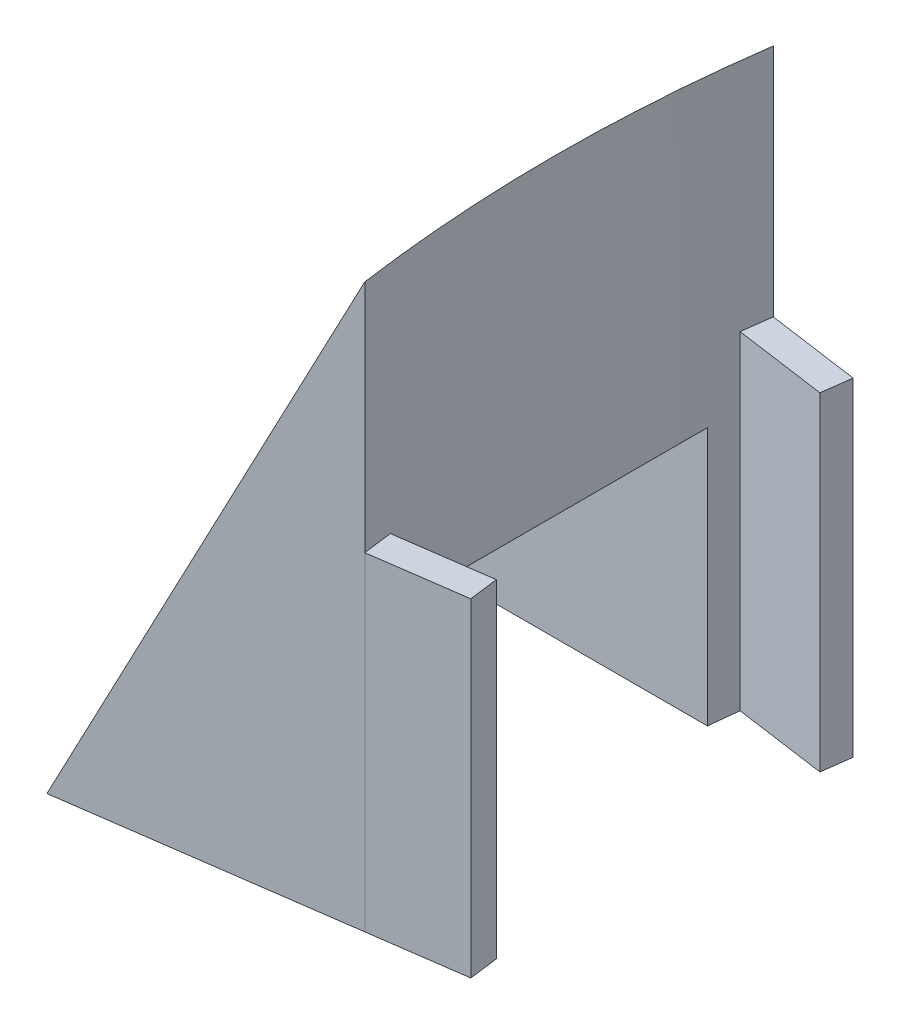
ISO-10303-21;
HEADER;
FILE_DESCRIPTION(('STEP AP214'),'2;1');
FILE_NAME('part.step','',(''),(''),'','','');
FILE_SCHEMA(('AUTOMOTIVE_DESIGN { 1 0 10303 214 1 1 1 1 }'));
ENDSEC;
DATA;
#1=APPLICATION_CONTEXT('core data for automotive mechanical design processes');
#2=APPLICATION_PROTOCOL_DEFINITION('international standard','automotive_design',2000,#1);
#3=PRODUCT_CONTEXT('',#1,'mechanical');
#4=PRODUCT('Part','Part','',(#3));
#5=PRODUCT_RELATED_PRODUCT_CATEGORY('part','',(#4));
#6=PRODUCT_DEFINITION_FORMATION('','',#4);
#7=PRODUCT_DEFINITION_CONTEXT('part definition',#1,'design');
#8=PRODUCT_DEFINITION('design','',#6,#7);
#9=PRODUCT_DEFINITION_SHAPE('','',#8);
#10=(LENGTH_UNIT() NAMED_UNIT(*) SI_UNIT(.MILLI.,.METRE.));
#11=(NAMED_UNIT(*) PLANE_ANGLE_UNIT() SI_UNIT($,.RADIAN.));
#12=(NAMED_UNIT(*) SI_UNIT($,.STERADIAN.) SOLID_ANGLE_UNIT());
#13=UNCERTAINTY_MEASURE_WITH_UNIT(LENGTH_MEASURE(1.E-05),#10,'distance_accuracy_value','');
#14=(GEOMETRIC_REPRESENTATION_CONTEXT(3) GLOBAL_UNCERTAINTY_ASSIGNED_CONTEXT((#13)) GLOBAL_UNIT_ASSIGNED_CONTEXT((#10,
#11,#12)) REPRESENTATION_CONTEXT('',''));
#15=CARTESIAN_POINT('',(0.,0.,0.));
#16=DIRECTION('',(0.,0.,1.));
#17=DIRECTION('',(1.,0.,0.));
#18=AXIS2_PLACEMENT_3D('',#15,#16,#17);
#19=CARTESIAN_POINT('',(-154.877925951182,35.,-21.7666729901543));
#20=DIRECTION('',(0.139173100960065,0.,-0.99026806874157));
#21=DIRECTION('',(-0.99026806874157,0.,-0.139173100960065));
#22=AXIS2_PLACEMENT_3D('',#19,#20,#21);
#23=PLANE('',#22);
#24=DIRECTION('',(0.99026806874157,0.,0.139173100960065));
#25=VECTOR('',#24,1.);
#26=CARTESIAN_POINT('',(-154.877925951182,0.,-21.7666729901543));
#27=LINE('',#26,#25);
#28=CARTESIAN_POINT('',(-154.877925951182,0.,-21.7666729901543));
#29=VERTEX_POINT('',#28);
#30=CARTESIAN_POINT('',(-144.975245263766,0.,-20.3749419805536));
#31=VERTEX_POINT('',#30);
#32=EDGE_CURVE('E112',#29,#31,#27,.T.);
#33=ORIENTED_EDGE('',*,*,#32,.F.);
#34=DIRECTION('',(0.,-1.,0.));
#35=VECTOR('',#34,1.);
#36=CARTESIAN_POINT('',(-154.877925951182,35.,-21.7666729901543));
#37=LINE('',#36,#35);
#38=CARTESIAN_POINT('',(-154.877925951182,35.,-21.7666729901543));
#39=VERTEX_POINT('',#38);
#40=EDGE_CURVE('E12',#39,#29,#37,.T.);
#41=ORIENTED_EDGE('',*,*,#40,.F.);
#42=DIRECTION('',(0.99026806874157,0.,0.139173100960065));
#43=VECTOR('',#42,1.);
#44=CARTESIAN_POINT('',(-154.877925951182,35.,-21.7666729901543));
#45=LINE('',#44,#43);
#46=CARTESIAN_POINT('',(-144.975245263766,35.,-20.3749419805536));
#47=VERTEX_POINT('',#46);
#48=EDGE_CURVE('E106',#39,#47,#45,.T.);
#49=ORIENTED_EDGE('',*,*,#48,.T.);
#50=DIRECTION('',(0.,-1.,0.));
#51=VECTOR('',#50,1.);
#52=CARTESIAN_POINT('',(-144.975245263766,35.,-20.3749419805536));
#53=LINE('',#52,#51);
#54=EDGE_CURVE('E51',#47,#31,#53,.T.);
#55=ORIENTED_EDGE('',*,*,#54,.T.);
#56=EDGE_LOOP('',(#33,#41,#49,#55));
#57=FACE_BOUND('',#56,.T.);
#58=ADVANCED_FACE('F48',(#57),#23,.T.);
#59=CARTESIAN_POINT('',(-154.877925951182,35.,-21.7666729901543));
#60=DIRECTION('',(-0.991621845760672,0.,-0.129174746023351));
#61=DIRECTION('',(-0.129174746023351,0.,0.991621845760672));
#62=AXIS2_PLACEMENT_3D('',#59,#60,#61);
#63=PLANE('',#62);
#64=DIRECTION('',(0.129174746023351,0.,-0.991621845760672));
#65=VECTOR('',#64,1.);
#66=CARTESIAN_POINT('',(-154.877925951182,0.,-21.7666729901543));
#67=LINE('',#66,#65);
#68=CARTESIAN_POINT('',(-155.285599304606,0.,-18.6371309114146));
#69=VERTEX_POINT('',#68);
#70=EDGE_CURVE('E108',#69,#29,#67,.T.);
#71=ORIENTED_EDGE('',*,*,#70,.F.);
#72=DIRECTION('',(0.,-1.,0.));
#73=VECTOR('',#72,1.);
#74=CARTESIAN_POINT('',(-155.285599304606,35.,-18.6371309114146));
#75=LINE('',#74,#73);
#76=CARTESIAN_POINT('',(-155.285599304606,35.,-18.6371309114146));
#77=VERTEX_POINT('',#76);
#78=EDGE_CURVE('E57',#77,#69,#75,.T.);
#79=ORIENTED_EDGE('',*,*,#78,.F.);
#80=DIRECTION('',(0.129174746023351,0.,-0.991621845760672));
#81=VECTOR('',#80,1.);
#82=CARTESIAN_POINT('',(-154.877925951182,35.,-21.7666729901543));
#83=LINE('',#82,#81);
#84=EDGE_CURVE('E103',#77,#39,#83,.T.);
#85=ORIENTED_EDGE('',*,*,#84,.T.);
#86=ORIENTED_EDGE('',*,*,#40,.T.);
#87=EDGE_LOOP('',(#71,#79,#85,#86));
#88=FACE_BOUND('',#87,.T.);
#89=ADVANCED_FACE('F122',(#88),#63,.T.);
#90=CARTESIAN_POINT('',(-155.285599304606,35.,-18.6371309114146));
#91=DIRECTION('',(-0.139173100960054,0.,0.990268068741572));
#92=DIRECTION('',(0.990268068741572,0.,0.139173100960054));
#93=AXIS2_PLACEMENT_3D('',#90,#91,#92);
#94=PLANE('',#93);
#95=DIRECTION('',(-0.990268068741572,0.,-0.139173100960054));
#96=VECTOR('',#95,1.);
#97=CARTESIAN_POINT('',(-155.285599304606,0.,-18.6371309114146));
#98=LINE('',#97,#96);
#99=CARTESIAN_POINT('',(-145.382918617191,0.,-17.2453999018141));
#100=VERTEX_POINT('',#99);
#101=EDGE_CURVE('E98',#100,#69,#98,.T.);
#102=ORIENTED_EDGE('',*,*,#101,.F.);
#103=DIRECTION('',(0.,-1.,0.));
#104=VECTOR('',#103,1.);
#105=CARTESIAN_POINT('',(-145.382918617191,35.,-17.2453999018141));
#106=LINE('',#105,#104);
#107=CARTESIAN_POINT('',(-145.382918617191,35.,-17.2453999018141));
#108=VERTEX_POINT('',#107);
#109=EDGE_CURVE('E93',#108,#100,#106,.T.);
#110=ORIENTED_EDGE('',*,*,#109,.F.);
#111=DIRECTION('',(-0.990268068741572,0.,-0.139173100960054));
#112=VECTOR('',#111,1.);
#113=CARTESIAN_POINT('',(-155.285599304606,35.,-18.6371309114146));
#114=LINE('',#113,#112);
#115=EDGE_CURVE('E96',#108,#77,#114,.T.);
#116=ORIENTED_EDGE('',*,*,#115,.T.);
#117=ORIENTED_EDGE('',*,*,#78,.T.);
#118=EDGE_LOOP('',(#102,#110,#116,#117));
#119=FACE_BOUND('',#118,.T.);
#120=ADVANCED_FACE('F95',(#119),#94,.T.);
#121=CARTESIAN_POINT('',(-144.975245263766,35.,-20.3749419805536));
#122=DIRECTION('',(0.991621845760672,0.,0.129174746023356));
#123=DIRECTION('',(0.129174746023356,0.,-0.991621845760672));
#124=AXIS2_PLACEMENT_3D('',#121,#122,#123);
#125=PLANE('',#124);
#126=DIRECTION('',(-0.129174746023356,0.,0.991621845760672));
#127=VECTOR('',#126,1.);
#128=CARTESIAN_POINT('',(-144.975245263766,0.,-20.3749419805536));
#129=LINE('',#128,#127);
#130=EDGE_CURVE('E115',#31,#100,#129,.T.);
#131=ORIENTED_EDGE('',*,*,#130,.F.);
#132=ORIENTED_EDGE('',*,*,#54,.F.);
#133=DIRECTION('',(-0.129174746023356,0.,0.991621845760672));
#134=VECTOR('',#133,1.);
#135=CARTESIAN_POINT('',(-144.975245263766,35.,-20.3749419805536));
#136=LINE('',#135,#134);
#137=EDGE_CURVE('E102',#47,#108,#136,.T.);
#138=ORIENTED_EDGE('',*,*,#137,.T.);
#139=ORIENTED_EDGE('',*,*,#109,.T.);
#140=EDGE_LOOP('',(#131,#132,#138,#139));
#141=FACE_BOUND('',#140,.T.);
#142=ADVANCED_FACE('F105',(#141),#125,.T.);
#143=CARTESIAN_POINT('',(0.,35.,0.));
#144=DIRECTION('',(0.,-1.,0.));
#145=DIRECTION('',(1.,0.,0.));
#146=AXIS2_PLACEMENT_3D('',#143,#144,#145);
#147=PLANE('',#146);
#148=ORIENTED_EDGE('',*,*,#48,.F.);
#149=ORIENTED_EDGE('',*,*,#84,.F.);
#150=ORIENTED_EDGE('',*,*,#115,.F.);
#151=ORIENTED_EDGE('',*,*,#137,.F.);
#152=EDGE_LOOP('',(#148,#149,#150,#151));
#153=FACE_BOUND('',#152,.T.);
#154=ADVANCED_FACE('F101',(#153),#147,.F.);
#155=CARTESIAN_POINT('',(0.,0.,0.));
#156=DIRECTION('',(0.,-1.,0.));
#157=DIRECTION('',(1.,0.,0.));
#158=AXIS2_PLACEMENT_3D('',#155,#156,#157);
#159=PLANE('',#158);
#160=ORIENTED_EDGE('',*,*,#32,.T.);
#161=ORIENTED_EDGE('',*,*,#130,.T.);
#162=ORIENTED_EDGE('',*,*,#101,.T.);
#163=ORIENTED_EDGE('',*,*,#70,.T.);
#164=EDGE_LOOP('',(#160,#161,#162,#163));
#165=FACE_BOUND('',#164,.T.);
#166=ADVANCED_FACE('F121',(#165),#159,.T.);
#167=CLOSED_SHELL('',(#58,#89,#120,#142,#154,#166));
#168=MANIFOLD_SOLID_BREP('B2',#167);
#169=CARTESIAN_POINT('',(-154.877925951182,35.,21.7666729901543));
#170=DIRECTION('',(0.139173100960066,0.,0.99026806874157));
#171=DIRECTION('',(0.99026806874157,0.,-0.139173100960066));
#172=AXIS2_PLACEMENT_3D('',#169,#170,#171);
#173=PLANE('',#172);
#174=DIRECTION('',(-0.99026806874157,0.,0.139173100960066));
#175=VECTOR('',#174,1.);
#176=CARTESIAN_POINT('',(-154.877925951182,0.,21.7666729901543));
#177=LINE('',#176,#175);
#178=CARTESIAN_POINT('',(-144.975245263766,0.,20.3749419805536));
#179=VERTEX_POINT('',#178);
#180=CARTESIAN_POINT('',(-154.877925951182,0.,21.7666729901543));
#181=VERTEX_POINT('',#180);
#182=EDGE_CURVE('E245',#179,#181,#177,.T.);
#183=ORIENTED_EDGE('',*,*,#182,.F.);
#184=DIRECTION('',(0.,-1.,0.));
#185=VECTOR('',#184,1.);
#186=CARTESIAN_POINT('',(-144.975245263766,35.,20.3749419805536));
#187=LINE('',#186,#185);
#188=CARTESIAN_POINT('',(-144.975245263766,35.,20.3749419805536));
#189=VERTEX_POINT('',#188);
#190=EDGE_CURVE('E46',#189,#179,#187,.T.);
#191=ORIENTED_EDGE('',*,*,#190,.F.);
#192=DIRECTION('',(-0.99026806874157,0.,0.139173100960066));
#193=VECTOR('',#192,1.);
#194=CARTESIAN_POINT('',(-154.877925951182,35.,21.7666729901543));
#195=LINE('',#194,#193);
#196=CARTESIAN_POINT('',(-154.877925951182,35.,21.7666729901543));
#197=VERTEX_POINT('',#196);
#198=EDGE_CURVE('E239',#189,#197,#195,.T.);
#199=ORIENTED_EDGE('',*,*,#198,.T.);
#200=DIRECTION('',(0.,-1.,0.));
#201=VECTOR('',#200,1.);
#202=CARTESIAN_POINT('',(-154.877925951182,35.,21.7666729901543));
#203=LINE('',#202,#201);
#204=EDGE_CURVE('E184',#197,#181,#203,.T.);
#205=ORIENTED_EDGE('',*,*,#204,.T.);
#206=EDGE_LOOP('',(#183,#191,#199,#205));
#207=FACE_BOUND('',#206,.T.);
#208=ADVANCED_FACE('F181',(#207),#173,.T.);
#209=CARTESIAN_POINT('',(-144.975245263766,35.,20.3749419805536));
#210=DIRECTION('',(0.991621845760672,0.,-0.129174746023356));
#211=DIRECTION('',(-0.129174746023356,0.,-0.991621845760672));
#212=AXIS2_PLACEMENT_3D('',#209,#210,#211);
#213=PLANE('',#212);
#214=DIRECTION('',(0.129174746023356,0.,0.991621845760672));
#215=VECTOR('',#214,1.);
#216=CARTESIAN_POINT('',(-144.975245263766,0.,20.3749419805536));
#217=LINE('',#216,#215);
#218=CARTESIAN_POINT('',(-145.382918617191,0.,17.2453999018141));
#219=VERTEX_POINT('',#218);
#220=EDGE_CURVE('E241',#219,#179,#217,.T.);
#221=ORIENTED_EDGE('',*,*,#220,.F.);
#222=DIRECTION('',(0.,-1.,0.));
#223=VECTOR('',#222,1.);
#224=CARTESIAN_POINT('',(-145.382918617191,35.,17.2453999018141));
#225=LINE('',#224,#223);
#226=CARTESIAN_POINT('',(-145.382918617191,35.,17.2453999018141));
#227=VERTEX_POINT('',#226);
#228=EDGE_CURVE('E190',#227,#219,#225,.T.);
#229=ORIENTED_EDGE('',*,*,#228,.F.);
#230=DIRECTION('',(0.129174746023356,0.,0.991621845760672));
#231=VECTOR('',#230,1.);
#232=CARTESIAN_POINT('',(-144.975245263766,35.,20.3749419805536));
#233=LINE('',#232,#231);
#234=EDGE_CURVE('E236',#227,#189,#233,.T.);
#235=ORIENTED_EDGE('',*,*,#234,.T.);
#236=ORIENTED_EDGE('',*,*,#190,.T.);
#237=EDGE_LOOP('',(#221,#229,#235,#236));
#238=FACE_BOUND('',#237,.T.);
#239=ADVANCED_FACE('F255',(#238),#213,.T.);
#240=CARTESIAN_POINT('',(-155.285599304606,35.,18.6371309114148));
#241=DIRECTION('',(-0.139173100960065,0.,-0.99026806874157));
#242=DIRECTION('',(-0.99026806874157,0.,0.139173100960065));
#243=AXIS2_PLACEMENT_3D('',#240,#241,#242);
#244=PLANE('',#243);
#245=DIRECTION('',(0.99026806874157,0.,-0.139173100960065));
#246=VECTOR('',#245,1.);
#247=CARTESIAN_POINT('',(-155.285599304606,0.,18.6371309114148));
#248=LINE('',#247,#246);
#249=CARTESIAN_POINT('',(-155.285599304606,0.,18.6371309114148));
#250=VERTEX_POINT('',#249);
#251=EDGE_CURVE('E231',#250,#219,#248,.T.);
#252=ORIENTED_EDGE('',*,*,#251,.F.);
#253=DIRECTION('',(0.,-1.,0.));
#254=VECTOR('',#253,1.);
#255=CARTESIAN_POINT('',(-155.285599304606,35.,18.6371309114148));
#256=LINE('',#255,#254);
#257=CARTESIAN_POINT('',(-155.285599304606,35.,18.6371309114148));
#258=VERTEX_POINT('',#257);
#259=EDGE_CURVE('E226',#258,#250,#256,.T.);
#260=ORIENTED_EDGE('',*,*,#259,.F.);
#261=DIRECTION('',(0.99026806874157,0.,-0.139173100960065));
#262=VECTOR('',#261,1.);
#263=CARTESIAN_POINT('',(-155.285599304606,35.,18.6371309114148));
#264=LINE('',#263,#262);
#265=EDGE_CURVE('E229',#258,#227,#264,.T.);
#266=ORIENTED_EDGE('',*,*,#265,.T.);
#267=ORIENTED_EDGE('',*,*,#228,.T.);
#268=EDGE_LOOP('',(#252,#260,#266,#267));
#269=FACE_BOUND('',#268,.T.);
#270=ADVANCED_FACE('F228',(#269),#244,.T.);
#271=CARTESIAN_POINT('',(-154.877925951182,35.,21.7666729901543));
#272=DIRECTION('',(-0.991621845760672,0.,0.129174746023356));
#273=DIRECTION('',(0.129174746023356,0.,0.991621845760672));
#274=AXIS2_PLACEMENT_3D('',#271,#272,#273);
#275=PLANE('',#274);
#276=DIRECTION('',(-0.129174746023356,0.,-0.991621845760672));
#277=VECTOR('',#276,1.);
#278=CARTESIAN_POINT('',(-154.877925951182,0.,21.7666729901543));
#279=LINE('',#278,#277);
#280=EDGE_CURVE('E248',#181,#250,#279,.T.);
#281=ORIENTED_EDGE('',*,*,#280,.F.);
#282=ORIENTED_EDGE('',*,*,#204,.F.);
#283=DIRECTION('',(-0.129174746023356,0.,-0.991621845760672));
#284=VECTOR('',#283,1.);
#285=CARTESIAN_POINT('',(-154.877925951182,35.,21.7666729901543));
#286=LINE('',#285,#284);
#287=EDGE_CURVE('E235',#197,#258,#286,.T.);
#288=ORIENTED_EDGE('',*,*,#287,.T.);
#289=ORIENTED_EDGE('',*,*,#259,.T.);
#290=EDGE_LOOP('',(#281,#282,#288,#289));
#291=FACE_BOUND('',#290,.T.);
#292=ADVANCED_FACE('F238',(#291),#275,.T.);
#293=CARTESIAN_POINT('',(0.,35.,0.));
#294=DIRECTION('',(0.,1.,0.));
#295=DIRECTION('',(-1.,0.,0.));
#296=AXIS2_PLACEMENT_3D('',#293,#294,#295);
#297=PLANE('',#296);
#298=ORIENTED_EDGE('',*,*,#198,.F.);
#299=ORIENTED_EDGE('',*,*,#234,.F.);
#300=ORIENTED_EDGE('',*,*,#265,.F.);
#301=ORIENTED_EDGE('',*,*,#287,.F.);
#302=EDGE_LOOP('',(#298,#299,#300,#301));
#303=FACE_BOUND('',#302,.T.);
#304=ADVANCED_FACE('F234',(#303),#297,.T.);
#305=CARTESIAN_POINT('',(0.,0.,0.));
#306=DIRECTION('',(0.,1.,0.));
#307=DIRECTION('',(-1.,0.,0.));
#308=AXIS2_PLACEMENT_3D('',#305,#306,#307);
#309=PLANE('',#308);
#310=ORIENTED_EDGE('',*,*,#182,.T.);
#311=ORIENTED_EDGE('',*,*,#280,.T.);
#312=ORIENTED_EDGE('',*,*,#251,.T.);
#313=ORIENTED_EDGE('',*,*,#220,.T.);
#314=EDGE_LOOP('',(#310,#311,#312,#313));
#315=FACE_BOUND('',#314,.T.);
#316=ADVANCED_FACE('F254',(#315),#309,.F.);
#317=CLOSED_SHELL('',(#208,#239,#270,#292,#304,#316));
#318=MANIFOLD_SOLID_BREP('B6',#317);
#319=CARTESIAN_POINT('',(0.,60.,0.));
#320=DIRECTION('',(0.,-1.,0.));
#321=DIRECTION('',(1.,0.,0.));
#322=AXIS2_PLACEMENT_3D('',#319,#320,#321);
#323=CONICAL_SURFACE('',#322,156.4,0.463647609000806);
#324=CARTESIAN_POINT('',(0.,0.,0.));
#325=DIRECTION('',(0.,1.,0.));
#326=DIRECTION('',(-1.,0.,0.));
#327=AXIS2_PLACEMENT_3D('',#324,#325,#326);
#328=CIRCLE('',#327,186.4);
#329=CARTESIAN_POINT('',(-184.585968013429,0.,-25.9418660189563));
#330=VERTEX_POINT('',#329);
#331=CARTESIAN_POINT('',(-184.585968013429,0.,25.9418660189563));
#332=VERTEX_POINT('',#331);
#333=EDGE_CURVE('E399',#330,#332,#328,.T.);
#334=ORIENTED_EDGE('',*,*,#333,.T.);
#335=DIRECTION('',(-0.442861343530717,-0.894427190999916,0.0622401028772297));
#336=VECTOR('',#335,1.);
#337=CARTESIAN_POINT('',(-154.877925951182,60.,21.7666729901543));
#338=LINE('',#337,#336);
#339=CARTESIAN_POINT('',(-154.877925951182,60.,21.7666729901543));
#340=VERTEX_POINT('',#339);
#341=EDGE_CURVE('E371',#340,#332,#338,.T.);
#342=ORIENTED_EDGE('',*,*,#341,.F.);
#343=CARTESIAN_POINT('',(0.,60.,0.));
#344=DIRECTION('',(0.,1.,0.));
#345=DIRECTION('',(-1.,0.,0.));
#346=AXIS2_PLACEMENT_3D('',#343,#344,#345);
#347=CIRCLE('',#346,156.4);
#348=CARTESIAN_POINT('',(-154.877925951182,60.,-21.7666729901543));
#349=VERTEX_POINT('',#348);
#350=EDGE_CURVE('E328',#349,#340,#347,.T.);
#351=ORIENTED_EDGE('',*,*,#350,.F.);
#352=DIRECTION('',(-0.442861343530717,-0.894427190999916,-0.0622401028772297));
#353=VECTOR('',#352,1.);
#354=CARTESIAN_POINT('',(-154.877925951182,60.,-21.7666729901543));
#355=LINE('',#354,#353);
#356=EDGE_CURVE('E389',#349,#330,#355,.T.);
#357=ORIENTED_EDGE('',*,*,#356,.T.);
#358=EDGE_LOOP('',(#334,#342,#351,#357));
#359=FACE_BOUND('',#358,.T.);
#360=ADVANCED_FACE('F305',(#359),#323,.T.);
#361=CARTESIAN_POINT('',(-184.585968013429,0.,-25.9418660189563));
#362=DIRECTION('',(0.,-1.,0.));
#363=DIRECTION('',(1.,0.,0.));
#364=AXIS2_PLACEMENT_3D('',#361,#362,#363);
#365=PLANE('',#364);
#366=DIRECTION('',(1.,0.,0.));
#367=VECTOR('',#366,1.);
#368=CARTESIAN_POINT('',(-183.162197198644,0.,15.5));
#369=LINE('',#368,#367);
#370=CARTESIAN_POINT('',(-183.162197198644,0.,15.5));
#371=VERTEX_POINT('',#370);
#372=CARTESIAN_POINT('',(-155.630042086996,0.,15.5));
#373=VERTEX_POINT('',#372);
#374=EDGE_CURVE('E372',#371,#373,#369,.T.);
#375=ORIENTED_EDGE('',*,*,#374,.T.);
#376=CARTESIAN_POINT('',(0.,0.,0.));
#377=DIRECTION('',(0.,1.,0.));
#378=DIRECTION('',(-1.,0.,0.));
#379=AXIS2_PLACEMENT_3D('',#376,#377,#378);
#380=CIRCLE('',#379,156.4);
#381=CARTESIAN_POINT('',(-154.877925951182,0.,21.7666729901543));
#382=VERTEX_POINT('',#381);
#383=EDGE_CURVE('E397',#373,#382,#380,.T.);
#384=ORIENTED_EDGE('',*,*,#383,.T.);
#385=DIRECTION('',(0.99026806874157,0.,-0.139173100960066));
#386=VECTOR('',#385,1.);
#387=CARTESIAN_POINT('',(-184.585968013429,0.,25.9418660189563));
#388=LINE('',#387,#386);
#389=EDGE_CURVE('E383',#332,#382,#388,.T.);
#390=ORIENTED_EDGE('',*,*,#389,.F.);
#391=ORIENTED_EDGE('',*,*,#333,.F.);
#392=DIRECTION('',(0.99026806874157,0.,0.139173100960066));
#393=VECTOR('',#392,1.);
#394=CARTESIAN_POINT('',(-184.585968013429,0.,-25.9418660189563));
#395=LINE('',#394,#393);
#396=CARTESIAN_POINT('',(-154.877925951182,0.,-21.7666729901543));
#397=VERTEX_POINT('',#396);
#398=EDGE_CURVE('E391',#330,#397,#395,.T.);
#399=ORIENTED_EDGE('',*,*,#398,.T.);
#400=CARTESIAN_POINT('',(-155.630042086996,0.,-15.5));
#401=VERTEX_POINT('',#400);
#402=EDGE_CURVE('E376',#397,#401,#380,.T.);
#403=ORIENTED_EDGE('',*,*,#402,.T.);
#404=DIRECTION('',(1.,0.,0.));
#405=VECTOR('',#404,1.);
#406=CARTESIAN_POINT('',(-183.162197198644,0.,-15.5));
#407=LINE('',#406,#405);
#408=CARTESIAN_POINT('',(-183.162197198644,0.,-15.5));
#409=VERTEX_POINT('',#408);
#410=EDGE_CURVE('E320',#409,#401,#407,.T.);
#411=ORIENTED_EDGE('',*,*,#410,.F.);
#412=DIRECTION('',(0.,0.,-1.));
#413=VECTOR('',#412,1.);
#414=CARTESIAN_POINT('',(-183.162197198644,0.,15.5));
#415=LINE('',#414,#413);
#416=EDGE_CURVE('E364',#371,#409,#415,.T.);
#417=ORIENTED_EDGE('',*,*,#416,.F.);
#418=EDGE_LOOP('',(#375,#384,#390,#391,#399,#403,#411,#417));
#419=FACE_BOUND('',#418,.T.);
#420=ADVANCED_FACE('F307',(#419),#365,.T.);
#421=CARTESIAN_POINT('',(0.,70.,0.));
#422=DIRECTION('',(0.,1.,0.));
#423=DIRECTION('',(-1.,0.,0.));
#424=AXIS2_PLACEMENT_3D('',#421,#422,#423);
#425=CYLINDRICAL_SURFACE('',#424,156.4);
#426=DIRECTION('',(0.,1.,0.));
#427=VECTOR('',#426,1.);
#428=CARTESIAN_POINT('',(-155.630042086996,70.,15.5));
#429=LINE('',#428,#427);
#430=CARTESIAN_POINT('',(-155.630042086996,27.5321551116478,15.5));
#431=VERTEX_POINT('',#430);
#432=EDGE_CURVE('E179',#431,#373,#429,.F.);
#433=ORIENTED_EDGE('',*,*,#432,.F.);
#434=CARTESIAN_POINT('',(0.,183.162197198642,0.));
#435=DIRECTION('',(0.707106781186544,-0.707106781186551,0.));
#436=DIRECTION('',(0.707106781186551,0.707106781186544,0.));
#437=AXIS2_PLACEMENT_3D('',#434,#435,#436);
#438=ELLIPSE('',#437,221.183001155151,156.4);
#439=CARTESIAN_POINT('',(-155.630042086996,27.5321551116478,-15.5));
#440=VERTEX_POINT('',#439);
#441=EDGE_CURVE('E313',#431,#440,#438,.T.);
#442=ORIENTED_EDGE('',*,*,#441,.T.);
#443=DIRECTION('',(0.,1.,0.));
#444=VECTOR('',#443,1.);
#445=CARTESIAN_POINT('',(-155.630042086996,70.,-15.5));
#446=LINE('',#445,#444);
#447=EDGE_CURVE('E359',#440,#401,#446,.F.);
#448=ORIENTED_EDGE('',*,*,#447,.T.);
#449=ORIENTED_EDGE('',*,*,#402,.F.);
#450=DIRECTION('',(0.,1.,0.));
#451=VECTOR('',#450,1.);
#452=CARTESIAN_POINT('',(-154.877925951182,0.,-21.7666729901543));
#453=LINE('',#452,#451);
#454=EDGE_CURVE('E393',#397,#349,#453,.T.);
#455=ORIENTED_EDGE('',*,*,#454,.T.);
#456=ORIENTED_EDGE('',*,*,#350,.T.);
#457=DIRECTION('',(0.,1.,0.));
#458=VECTOR('',#457,1.);
#459=CARTESIAN_POINT('',(-154.877925951182,0.,21.7666729901543));
#460=LINE('',#459,#458);
#461=EDGE_CURVE('E386',#382,#340,#460,.T.);
#462=ORIENTED_EDGE('',*,*,#461,.F.);
#463=ORIENTED_EDGE('',*,*,#383,.F.);
#464=EDGE_LOOP('',(#433,#442,#448,#449,#455,#456,#462,#463));
#465=FACE_BOUND('',#464,.T.);
#466=ADVANCED_FACE('F403',(#465),#425,.F.);
#467=CARTESIAN_POINT('',(0.,0.,0.));
#468=DIRECTION('',(-0.139173100960066,0.,0.99026806874157));
#469=DIRECTION('',(0.99026806874157,0.,0.139173100960066));
#470=AXIS2_PLACEMENT_3D('',#467,#468,#469);
#471=PLANE('',#470);
#472=ORIENTED_EDGE('',*,*,#356,.F.);
#473=ORIENTED_EDGE('',*,*,#454,.F.);
#474=ORIENTED_EDGE('',*,*,#398,.F.);
#475=EDGE_LOOP('',(#472,#473,#474));
#476=FACE_BOUND('',#475,.T.);
#477=ADVANCED_FACE('F414',(#476),#471,.F.);
#478=CARTESIAN_POINT('',(0.,0.,0.));
#479=DIRECTION('',(0.139173100960066,0.,0.99026806874157));
#480=DIRECTION('',(0.99026806874157,0.,-0.139173100960066));
#481=AXIS2_PLACEMENT_3D('',#478,#479,#480);
#482=PLANE('',#481);
#483=ORIENTED_EDGE('',*,*,#341,.T.);
#484=ORIENTED_EDGE('',*,*,#389,.T.);
#485=ORIENTED_EDGE('',*,*,#461,.T.);
#486=EDGE_LOOP('',(#483,#484,#485));
#487=FACE_BOUND('',#486,.T.);
#488=ADVANCED_FACE('F410',(#487),#482,.T.);
#489=CARTESIAN_POINT('',(-154.877925951182,28.2842712474617,15.5));
#490=DIRECTION('',(0.707106781186544,-0.707106781186551,0.));
#491=DIRECTION('',(0.707106781186551,0.707106781186544,0.));
#492=AXIS2_PLACEMENT_3D('',#489,#490,#491);
#493=PLANE('',#492);
#494=DIRECTION('',(-0.707106781186551,-0.707106781186544,0.));
#495=VECTOR('',#494,1.);
#496=CARTESIAN_POINT('',(-154.877925951182,28.2842712474617,15.5));
#497=LINE('',#496,#495);
#498=EDGE_CURVE('E367',#431,#371,#497,.T.);
#499=ORIENTED_EDGE('',*,*,#498,.T.);
#500=ORIENTED_EDGE('',*,*,#416,.T.);
#501=DIRECTION('',(-0.707106781186551,-0.707106781186544,0.));
#502=VECTOR('',#501,1.);
#503=CARTESIAN_POINT('',(-154.877925951182,28.2842712474617,-15.5));
#504=LINE('',#503,#502);
#505=EDGE_CURVE('E356',#440,#409,#504,.T.);
#506=ORIENTED_EDGE('',*,*,#505,.F.);
#507=ORIENTED_EDGE('',*,*,#441,.F.);
#508=EDGE_LOOP('',(#499,#500,#506,#507));
#509=FACE_BOUND('',#508,.T.);
#510=ADVANCED_FACE('F365',(#509),#493,.T.);
#511=CARTESIAN_POINT('',(0.,0.,15.5));
#512=DIRECTION('',(0.,0.,1.));
#513=DIRECTION('',(1.,0.,0.));
#514=AXIS2_PLACEMENT_3D('',#511,#512,#513);
#515=PLANE('',#514);
#516=ORIENTED_EDGE('',*,*,#432,.T.);
#517=ORIENTED_EDGE('',*,*,#374,.F.);
#518=ORIENTED_EDGE('',*,*,#498,.F.);
#519=EDGE_LOOP('',(#516,#517,#518));
#520=FACE_BOUND('',#519,.T.);
#521=ADVANCED_FACE('F406',(#520),#515,.F.);
#522=CARTESIAN_POINT('',(0.,0.,-15.5));
#523=DIRECTION('',(0.,0.,1.));
#524=DIRECTION('',(1.,0.,0.));
#525=AXIS2_PLACEMENT_3D('',#522,#523,#524);
#526=PLANE('',#525);
#527=ORIENTED_EDGE('',*,*,#505,.T.);
#528=ORIENTED_EDGE('',*,*,#410,.T.);
#529=ORIENTED_EDGE('',*,*,#447,.F.);
#530=EDGE_LOOP('',(#527,#528,#529));
#531=FACE_BOUND('',#530,.T.);
#532=ADVANCED_FACE('F358',(#531),#526,.T.);
#533=CLOSED_SHELL('',(#360,#420,#466,#477,#488,#510,#521,#532));
#534=MANIFOLD_SOLID_BREP('B40',#533);
#535=ADVANCED_BREP_SHAPE_REPRESENTATION('',(#18,#168,#318,#534),#14);
#536=SHAPE_DEFINITION_REPRESENTATION(#9,#535);
ENDSEC;
END-ISO-10303-21;
